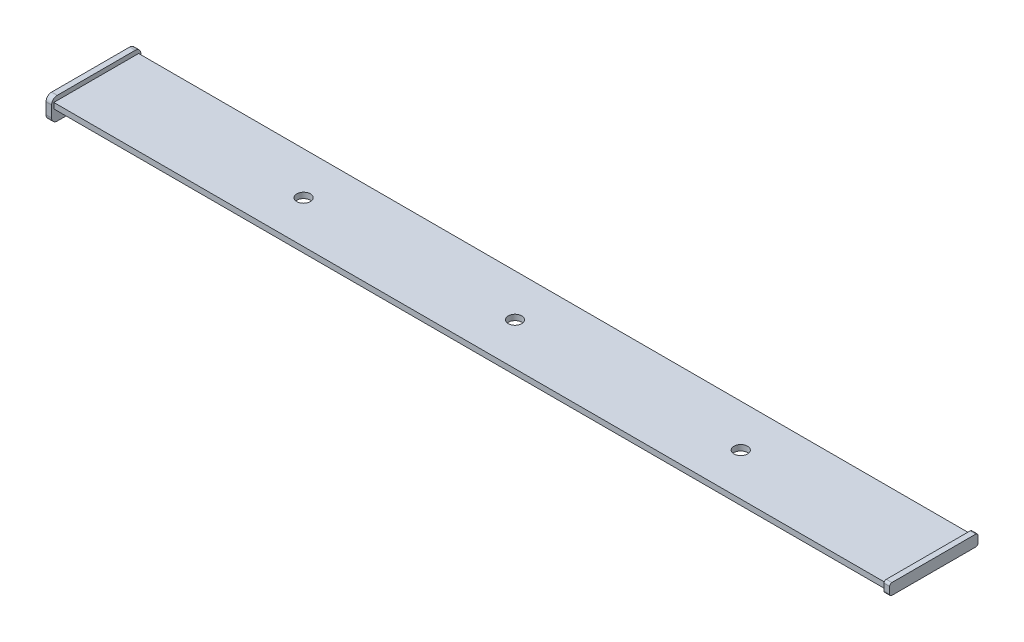
ISO-10303-21;
HEADER;
FILE_DESCRIPTION(('STEP AP214'),'2;1');
FILE_NAME('part.step','',(''),(''),'','','');
FILE_SCHEMA(('AUTOMOTIVE_DESIGN { 1 0 10303 214 1 1 1 1 }'));
ENDSEC;
DATA;
#1=APPLICATION_CONTEXT('core data for automotive mechanical design processes');
#2=APPLICATION_PROTOCOL_DEFINITION('international standard','automotive_design',2000,#1);
#3=PRODUCT_CONTEXT('',#1,'mechanical');
#4=PRODUCT('Part','Part','',(#3));
#5=PRODUCT_RELATED_PRODUCT_CATEGORY('part','',(#4));
#6=PRODUCT_DEFINITION_FORMATION('','',#4);
#7=PRODUCT_DEFINITION_CONTEXT('part definition',#1,'design');
#8=PRODUCT_DEFINITION('design','',#6,#7);
#9=PRODUCT_DEFINITION_SHAPE('','',#8);
#10=(LENGTH_UNIT() NAMED_UNIT(*) SI_UNIT(.MILLI.,.METRE.));
#11=(NAMED_UNIT(*) PLANE_ANGLE_UNIT() SI_UNIT($,.RADIAN.));
#12=(NAMED_UNIT(*) SI_UNIT($,.STERADIAN.) SOLID_ANGLE_UNIT());
#13=UNCERTAINTY_MEASURE_WITH_UNIT(LENGTH_MEASURE(1.E-05),#10,'distance_accuracy_value','');
#14=(GEOMETRIC_REPRESENTATION_CONTEXT(3) GLOBAL_UNCERTAINTY_ASSIGNED_CONTEXT((#13)) GLOBAL_UNIT_ASSIGNED_CONTEXT((#10,
#11,#12)) REPRESENTATION_CONTEXT('',''));
#15=CARTESIAN_POINT('',(0.,0.,0.));
#16=DIRECTION('',(0.,0.,1.));
#17=DIRECTION('',(1.,0.,0.));
#18=AXIS2_PLACEMENT_3D('',#15,#16,#17);
#19=CARTESIAN_POINT('',(0.,0.,0.));
#20=DIRECTION('',(0.,-1.,0.));
#21=DIRECTION('',(0.,0.,-1.));
#22=AXIS2_PLACEMENT_3D('',#19,#20,#21);
#23=PLANE('',#22);
#24=DIRECTION('',(-1.,0.,0.));
#25=VECTOR('',#24,1.);
#26=CARTESIAN_POINT('',(0.,0.,157.611800850735));
#27=LINE('',#26,#25);
#28=CARTESIAN_POINT('',(1850.,0.,157.611800850736));
#29=VERTEX_POINT('',#28);
#30=CARTESIAN_POINT('',(-1875.,0.,157.611800850735));
#31=VERTEX_POINT('',#30);
#32=EDGE_CURVE('E52',#29,#31,#27,.T.);
#33=ORIENTED_EDGE('',*,*,#32,.F.);
#34=DIRECTION('',(0.,0.,1.));
#35=VECTOR('',#34,1.);
#36=CARTESIAN_POINT('',(1850.,0.,0.));
#37=LINE('',#36,#35);
#38=CARTESIAN_POINT('',(1850.,0.,189.84375));
#39=VERTEX_POINT('',#38);
#40=EDGE_CURVE('E67',#29,#39,#37,.T.);
#41=ORIENTED_EDGE('',*,*,#40,.T.);
#42=DIRECTION('',(1.,0.,0.));
#43=VECTOR('',#42,1.);
#44=CARTESIAN_POINT('',(-1875.,0.,189.84375));
#45=LINE('',#44,#43);
#46=CARTESIAN_POINT('',(-1875.,0.,189.84375));
#47=VERTEX_POINT('',#46);
#48=EDGE_CURVE('E469',#47,#39,#45,.T.);
#49=ORIENTED_EDGE('',*,*,#48,.F.);
#50=DIRECTION('',(0.,0.,1.));
#51=VECTOR('',#50,1.);
#52=CARTESIAN_POINT('',(-1875.,0.,189.84375));
#53=LINE('',#52,#51);
#54=EDGE_CURVE('E480',#31,#47,#53,.T.);
#55=ORIENTED_EDGE('',*,*,#54,.F.);
#56=EDGE_LOOP('',(#33,#41,#49,#55));
#57=FACE_BOUND('',#56,.T.);
#58=ADVANCED_FACE('F43',(#57),#23,.T.);
#59=DIRECTION('',(-1.,0.,0.));
#60=VECTOR('',#59,1.);
#61=CARTESIAN_POINT('',(-1875.,0.,-189.84375));
#62=LINE('',#61,#60);
#63=CARTESIAN_POINT('',(1850.,0.,-189.84375));
#64=VERTEX_POINT('',#63);
#65=CARTESIAN_POINT('',(-1875.,0.,-189.84375));
#66=VERTEX_POINT('',#65);
#67=EDGE_CURVE('E439',#64,#66,#62,.T.);
#68=ORIENTED_EDGE('',*,*,#67,.F.);
#69=DIRECTION('',(0.,0.,1.));
#70=VECTOR('',#69,1.);
#71=CARTESIAN_POINT('',(1850.,0.,0.));
#72=LINE('',#71,#70);
#73=CARTESIAN_POINT('',(1850.,0.,-157.611800850736));
#74=VERTEX_POINT('',#73);
#75=EDGE_CURVE('E385',#64,#74,#72,.T.);
#76=ORIENTED_EDGE('',*,*,#75,.T.);
#77=DIRECTION('',(1.,0.,0.));
#78=VECTOR('',#77,1.);
#79=CARTESIAN_POINT('',(1931.14623816858,0.,-157.611800850736));
#80=LINE('',#79,#78);
#81=CARTESIAN_POINT('',(-1875.,0.,-157.611800850735));
#82=VERTEX_POINT('',#81);
#83=EDGE_CURVE('E435',#82,#74,#80,.T.);
#84=ORIENTED_EDGE('',*,*,#83,.F.);
#85=EDGE_CURVE('E481',#66,#82,#53,.T.);
#86=ORIENTED_EDGE('',*,*,#85,.F.);
#87=EDGE_LOOP('',(#68,#76,#84,#86));
#88=FACE_BOUND('',#87,.T.);
#89=ADVANCED_FACE('F533',(#88),#23,.T.);
#90=CARTESIAN_POINT('',(-1875.,25.,-189.84375));
#91=DIRECTION('',(0.,0.,1.));
#92=DIRECTION('',(1.,0.,0.));
#93=AXIS2_PLACEMENT_3D('',#90,#91,#92);
#94=PLANE('',#93);
#95=DIRECTION('',(0.,1.,0.));
#96=VECTOR('',#95,1.);
#97=CARTESIAN_POINT('',(1850.,25.,-189.84375));
#98=LINE('',#97,#96);
#99=CARTESIAN_POINT('',(1850.,25.,-189.84375));
#100=VERTEX_POINT('',#99);
#101=EDGE_CURVE('E59',#64,#100,#98,.T.);
#102=ORIENTED_EDGE('',*,*,#101,.F.);
#103=ORIENTED_EDGE('',*,*,#67,.T.);
#104=DIRECTION('',(0.,-1.,0.));
#105=VECTOR('',#104,1.);
#106=CARTESIAN_POINT('',(-1875.,25.,-189.84375));
#107=LINE('',#106,#105);
#108=CARTESIAN_POINT('',(-1875.,25.,-189.84375));
#109=VERTEX_POINT('',#108);
#110=EDGE_CURVE('E490',#109,#66,#107,.T.);
#111=ORIENTED_EDGE('',*,*,#110,.F.);
#112=DIRECTION('',(-1.,0.,0.));
#113=VECTOR('',#112,1.);
#114=CARTESIAN_POINT('',(-1875.,25.,-189.84375));
#115=LINE('',#114,#113);
#116=EDGE_CURVE('E464',#100,#109,#115,.T.);
#117=ORIENTED_EDGE('',*,*,#116,.F.);
#118=EDGE_LOOP('',(#102,#103,#111,#117));
#119=FACE_BOUND('',#118,.T.);
#120=ADVANCED_FACE('F530',(#119),#94,.F.);
#121=CARTESIAN_POINT('',(-1875.,25.,189.84375));
#122=DIRECTION('',(0.,0.,-1.));
#123=DIRECTION('',(-1.,0.,0.));
#124=AXIS2_PLACEMENT_3D('',#121,#122,#123);
#125=PLANE('',#124);
#126=DIRECTION('',(0.,-1.,0.));
#127=VECTOR('',#126,1.);
#128=CARTESIAN_POINT('',(1850.,25.,189.84375));
#129=LINE('',#128,#127);
#130=CARTESIAN_POINT('',(1850.,25.,189.84375));
#131=VERTEX_POINT('',#130);
#132=EDGE_CURVE('E381',#131,#39,#129,.T.);
#133=ORIENTED_EDGE('',*,*,#132,.F.);
#134=DIRECTION('',(1.,0.,0.));
#135=VECTOR('',#134,1.);
#136=CARTESIAN_POINT('',(-1875.,25.,189.84375));
#137=LINE('',#136,#135);
#138=CARTESIAN_POINT('',(-1875.,25.,189.84375));
#139=VERTEX_POINT('',#138);
#140=EDGE_CURVE('E473',#139,#131,#137,.T.);
#141=ORIENTED_EDGE('',*,*,#140,.F.);
#142=DIRECTION('',(0.,-1.,0.));
#143=VECTOR('',#142,1.);
#144=CARTESIAN_POINT('',(-1875.,25.,189.84375));
#145=LINE('',#144,#143);
#146=EDGE_CURVE('E477',#139,#47,#145,.T.);
#147=ORIENTED_EDGE('',*,*,#146,.T.);
#148=ORIENTED_EDGE('',*,*,#48,.T.);
#149=EDGE_LOOP('',(#133,#141,#147,#148));
#150=FACE_BOUND('',#149,.T.);
#151=ADVANCED_FACE('F525',(#150),#125,.F.);
#152=CARTESIAN_POINT('',(0.,25.,0.));
#153=DIRECTION('',(0.,-1.,0.));
#154=DIRECTION('',(0.,0.,-1.));
#155=AXIS2_PLACEMENT_3D('',#152,#153,#154);
#156=PLANE('',#155);
#157=CARTESIAN_POINT('',(0.,25.,0.));
#158=DIRECTION('',(0.,-1.,0.));
#159=DIRECTION('',(0.,0.,-1.));
#160=AXIS2_PLACEMENT_3D('',#157,#158,#159);
#161=CIRCLE('',#160,30.3811390822481);
#162=CARTESIAN_POINT('',(0.,25.,-30.3811390822481));
#163=VERTEX_POINT('',#162);
#164=EDGE_CURVE('E411',#163,#163,#161,.T.);
#165=ORIENTED_EDGE('',*,*,#164,.T.);
#166=EDGE_LOOP('',(#165));
#167=FACE_BOUND('',#166,.T.);
#168=CARTESIAN_POINT('',(-946.305515807381,25.,0.));
#169=DIRECTION('',(0.,-1.,0.));
#170=DIRECTION('',(0.,0.,-1.));
#171=AXIS2_PLACEMENT_3D('',#168,#169,#170);
#172=CIRCLE('',#171,30.3811390822481);
#173=CARTESIAN_POINT('',(-946.305515807381,25.,-30.3811390822481));
#174=VERTEX_POINT('',#173);
#175=EDGE_CURVE('E400',#174,#174,#172,.T.);
#176=ORIENTED_EDGE('',*,*,#175,.T.);
#177=EDGE_LOOP('',(#176));
#178=FACE_BOUND('',#177,.T.);
#179=CARTESIAN_POINT('',(1010.60365189735,25.,0.));
#180=DIRECTION('',(0.,-1.,0.));
#181=DIRECTION('',(0.,0.,-1.));
#182=AXIS2_PLACEMENT_3D('',#179,#180,#181);
#183=CIRCLE('',#182,30.3811390822481);
#184=CARTESIAN_POINT('',(1010.60365189735,25.,-30.3811390822481));
#185=VERTEX_POINT('',#184);
#186=EDGE_CURVE('E394',#185,#185,#183,.T.);
#187=ORIENTED_EDGE('',*,*,#186,.T.);
#188=EDGE_LOOP('',(#187));
#189=FACE_BOUND('',#188,.T.);
#190=DIRECTION('',(0.,0.,1.));
#191=VECTOR('',#190,1.);
#192=CARTESIAN_POINT('',(1850.,25.,0.));
#193=LINE('',#192,#191);
#194=EDGE_CURVE('E388',#100,#131,#193,.T.);
#195=ORIENTED_EDGE('',*,*,#194,.F.);
#196=ORIENTED_EDGE('',*,*,#116,.T.);
#197=DIRECTION('',(0.,0.,1.));
#198=VECTOR('',#197,1.);
#199=CARTESIAN_POINT('',(-1875.,25.,189.84375));
#200=LINE('',#199,#198);
#201=EDGE_CURVE('E468',#109,#139,#200,.T.);
#202=ORIENTED_EDGE('',*,*,#201,.T.);
#203=ORIENTED_EDGE('',*,*,#140,.T.);
#204=EDGE_LOOP('',(#195,#196,#202,#203));
#205=FACE_BOUND('',#204,.T.);
#206=ADVANCED_FACE('F527',(#167,#178,#189,#205),#156,.F.);
#207=CARTESIAN_POINT('',(1010.60365189735,0.,0.));
#208=DIRECTION('',(0.,-1.,0.));
#209=DIRECTION('',(0.,0.,-1.));
#210=AXIS2_PLACEMENT_3D('',#207,#208,#209);
#211=CIRCLE('',#210,30.3811390822481);
#212=CARTESIAN_POINT('',(1010.60365189735,0.,-30.3811390822481));
#213=VERTEX_POINT('',#212);
#214=EDGE_CURVE('E404',#213,#213,#211,.T.);
#215=ORIENTED_EDGE('',*,*,#214,.F.);
#216=EDGE_LOOP('',(#215));
#217=FACE_BOUND('',#216,.T.);
#218=CARTESIAN_POINT('',(-946.305515807381,0.,0.));
#219=DIRECTION('',(0.,-1.,0.));
#220=DIRECTION('',(0.,0.,-1.));
#221=AXIS2_PLACEMENT_3D('',#218,#219,#220);
#222=CIRCLE('',#221,30.3811390822481);
#223=CARTESIAN_POINT('',(-946.305515807381,0.,-30.3811390822481));
#224=VERTEX_POINT('',#223);
#225=EDGE_CURVE('E395',#224,#224,#222,.T.);
#226=ORIENTED_EDGE('',*,*,#225,.F.);
#227=EDGE_LOOP('',(#226));
#228=FACE_BOUND('',#227,.T.);
#229=CARTESIAN_POINT('',(0.,0.,0.));
#230=DIRECTION('',(0.,-1.,0.));
#231=DIRECTION('',(0.,0.,-1.));
#232=AXIS2_PLACEMENT_3D('',#229,#230,#231);
#233=CIRCLE('',#232,30.3811390822481);
#234=CARTESIAN_POINT('',(0.,0.,-30.3811390822481));
#235=VERTEX_POINT('',#234);
#236=EDGE_CURVE('E399',#235,#235,#233,.T.);
#237=ORIENTED_EDGE('',*,*,#236,.F.);
#238=EDGE_LOOP('',(#237));
#239=FACE_BOUND('',#238,.T.);
#240=DIRECTION('',(-1.,0.,0.));
#241=VECTOR('',#240,1.);
#242=CARTESIAN_POINT('',(0.,0.,-142.611800850735));
#243=LINE('',#242,#241);
#244=CARTESIAN_POINT('',(1850.,0.,-142.611800850736));
#245=VERTEX_POINT('',#244);
#246=CARTESIAN_POINT('',(-1875.,0.,-142.611800850735));
#247=VERTEX_POINT('',#246);
#248=EDGE_CURVE('E493',#245,#247,#243,.T.);
#249=ORIENTED_EDGE('',*,*,#248,.F.);
#250=DIRECTION('',(0.,0.,1.));
#251=VECTOR('',#250,1.);
#252=CARTESIAN_POINT('',(1850.,0.,0.));
#253=LINE('',#252,#251);
#254=CARTESIAN_POINT('',(1850.,0.,142.611800850736));
#255=VERTEX_POINT('',#254);
#256=EDGE_CURVE('E359',#245,#255,#253,.T.);
#257=ORIENTED_EDGE('',*,*,#256,.T.);
#258=DIRECTION('',(1.,0.,0.));
#259=VECTOR('',#258,1.);
#260=CARTESIAN_POINT('',(1931.14623816858,0.,142.611800850736));
#261=LINE('',#260,#259);
#262=CARTESIAN_POINT('',(-1875.,0.,142.611800850735));
#263=VERTEX_POINT('',#262);
#264=EDGE_CURVE('E424',#263,#255,#261,.T.);
#265=ORIENTED_EDGE('',*,*,#264,.F.);
#266=EDGE_CURVE('E484',#247,#263,#53,.T.);
#267=ORIENTED_EDGE('',*,*,#266,.F.);
#268=EDGE_LOOP('',(#249,#257,#265,#267));
#269=FACE_BOUND('',#268,.T.);
#270=ADVANCED_FACE('F516',(#217,#228,#239,#269),#23,.T.);
#271=CARTESIAN_POINT('',(0.,15.,0.));
#272=DIRECTION('',(0.,1.,0.));
#273=DIRECTION('',(0.,0.,1.));
#274=AXIS2_PLACEMENT_3D('',#271,#272,#273);
#275=PLANE('',#274);
#276=DIRECTION('',(0.,0.,-1.));
#277=VECTOR('',#276,1.);
#278=CARTESIAN_POINT('',(1850.,15.,0.));
#279=LINE('',#278,#277);
#280=CARTESIAN_POINT('',(1850.,15.,-142.611800850736));
#281=VERTEX_POINT('',#280);
#282=CARTESIAN_POINT('',(1850.,15.,-157.611800850736));
#283=VERTEX_POINT('',#282);
#284=EDGE_CURVE('E371',#281,#283,#279,.T.);
#285=ORIENTED_EDGE('',*,*,#284,.F.);
#286=DIRECTION('',(-1.,0.,0.));
#287=VECTOR('',#286,1.);
#288=CARTESIAN_POINT('',(1931.14623816858,15.,-142.611800850736));
#289=LINE('',#288,#287);
#290=CARTESIAN_POINT('',(-1875.,15.,-142.611800850735));
#291=VERTEX_POINT('',#290);
#292=EDGE_CURVE('E457',#281,#291,#289,.T.);
#293=ORIENTED_EDGE('',*,*,#292,.T.);
#294=DIRECTION('',(0.,0.,-1.));
#295=VECTOR('',#294,1.);
#296=CARTESIAN_POINT('',(-1875.,15.,-157.611800850735));
#297=LINE('',#296,#295);
#298=CARTESIAN_POINT('',(-1875.,15.,-157.611800850735));
#299=VERTEX_POINT('',#298);
#300=EDGE_CURVE('E446',#291,#299,#297,.T.);
#301=ORIENTED_EDGE('',*,*,#300,.T.);
#302=DIRECTION('',(1.,0.,0.));
#303=VECTOR('',#302,1.);
#304=CARTESIAN_POINT('',(1931.14623816858,15.,-157.611800850736));
#305=LINE('',#304,#303);
#306=EDGE_CURVE('E453',#299,#283,#305,.T.);
#307=ORIENTED_EDGE('',*,*,#306,.T.);
#308=EDGE_LOOP('',(#285,#293,#301,#307));
#309=FACE_BOUND('',#308,.T.);
#310=ADVANCED_FACE('F539',(#309),#275,.F.);
#311=CARTESIAN_POINT('',(1931.14623816858,15.,-157.611800850736));
#312=DIRECTION('',(0.,0.,-1.));
#313=DIRECTION('',(-1.,0.,0.));
#314=AXIS2_PLACEMENT_3D('',#311,#312,#313);
#315=PLANE('',#314);
#316=DIRECTION('',(0.,-1.,0.));
#317=VECTOR('',#316,1.);
#318=CARTESIAN_POINT('',(1850.,15.,-157.611800850736));
#319=LINE('',#318,#317);
#320=EDGE_CURVE('E377',#283,#74,#319,.T.);
#321=ORIENTED_EDGE('',*,*,#320,.F.);
#322=ORIENTED_EDGE('',*,*,#306,.F.);
#323=DIRECTION('',(0.,-1.,0.));
#324=VECTOR('',#323,1.);
#325=CARTESIAN_POINT('',(-1875.,15.,-157.611800850735));
#326=LINE('',#325,#324);
#327=EDGE_CURVE('E415',#299,#82,#326,.T.);
#328=ORIENTED_EDGE('',*,*,#327,.T.);
#329=ORIENTED_EDGE('',*,*,#83,.T.);
#330=EDGE_LOOP('',(#321,#322,#328,#329));
#331=FACE_BOUND('',#330,.T.);
#332=ADVANCED_FACE('F535',(#331),#315,.F.);
#333=CARTESIAN_POINT('',(1931.14623816858,15.,-142.611800850736));
#334=DIRECTION('',(0.,0.,1.));
#335=DIRECTION('',(1.,0.,0.));
#336=AXIS2_PLACEMENT_3D('',#333,#334,#335);
#337=PLANE('',#336);
#338=DIRECTION('',(0.,1.,0.));
#339=VECTOR('',#338,1.);
#340=CARTESIAN_POINT('',(1850.,15.,-142.611800850736));
#341=LINE('',#340,#339);
#342=EDGE_CURVE('E367',#245,#281,#341,.T.);
#343=ORIENTED_EDGE('',*,*,#342,.F.);
#344=ORIENTED_EDGE('',*,*,#248,.T.);
#345=DIRECTION('',(0.,-1.,0.));
#346=VECTOR('',#345,1.);
#347=CARTESIAN_POINT('',(-1875.,15.,-142.611800850735));
#348=LINE('',#347,#346);
#349=EDGE_CURVE('E443',#291,#247,#348,.T.);
#350=ORIENTED_EDGE('',*,*,#349,.F.);
#351=ORIENTED_EDGE('',*,*,#292,.F.);
#352=EDGE_LOOP('',(#343,#344,#350,#351));
#353=FACE_BOUND('',#352,.T.);
#354=ADVANCED_FACE('F541',(#353),#337,.F.);
#355=CARTESIAN_POINT('',(0.,15.,0.));
#356=DIRECTION('',(0.,1.,0.));
#357=DIRECTION('',(0.,0.,1.));
#358=AXIS2_PLACEMENT_3D('',#355,#356,#357);
#359=PLANE('',#358);
#360=DIRECTION('',(0.,0.,-1.));
#361=VECTOR('',#360,1.);
#362=CARTESIAN_POINT('',(1850.,15.,0.));
#363=LINE('',#362,#361);
#364=CARTESIAN_POINT('',(1850.,15.,157.611800850736));
#365=VERTEX_POINT('',#364);
#366=CARTESIAN_POINT('',(1850.,15.,142.611800850736));
#367=VERTEX_POINT('',#366);
#368=EDGE_CURVE('E335',#365,#367,#363,.T.);
#369=ORIENTED_EDGE('',*,*,#368,.F.);
#370=DIRECTION('',(-1.,0.,0.));
#371=VECTOR('',#370,1.);
#372=CARTESIAN_POINT('',(1931.14623816858,15.,157.611800850736));
#373=LINE('',#372,#371);
#374=CARTESIAN_POINT('',(-1875.,15.,157.611800850735));
#375=VERTEX_POINT('',#374);
#376=EDGE_CURVE('E428',#365,#375,#373,.T.);
#377=ORIENTED_EDGE('',*,*,#376,.T.);
#378=DIRECTION('',(0.,0.,-1.));
#379=VECTOR('',#378,1.);
#380=CARTESIAN_POINT('',(-1875.,15.,157.611800850735));
#381=LINE('',#380,#379);
#382=CARTESIAN_POINT('',(-1875.,15.,142.611800850735));
#383=VERTEX_POINT('',#382);
#384=EDGE_CURVE('E419',#375,#383,#381,.T.);
#385=ORIENTED_EDGE('',*,*,#384,.T.);
#386=DIRECTION('',(1.,0.,0.));
#387=VECTOR('',#386,1.);
#388=CARTESIAN_POINT('',(1931.14623816858,15.,142.611800850736));
#389=LINE('',#388,#387);
#390=EDGE_CURVE('E423',#383,#367,#389,.T.);
#391=ORIENTED_EDGE('',*,*,#390,.T.);
#392=EDGE_LOOP('',(#369,#377,#385,#391));
#393=FACE_BOUND('',#392,.T.);
#394=ADVANCED_FACE('F522',(#393),#359,.F.);
#395=CARTESIAN_POINT('',(1931.14623816858,15.,157.611800850736));
#396=DIRECTION('',(0.,0.,1.));
#397=DIRECTION('',(1.,0.,0.));
#398=AXIS2_PLACEMENT_3D('',#395,#396,#397);
#399=PLANE('',#398);
#400=DIRECTION('',(0.,1.,0.));
#401=VECTOR('',#400,1.);
#402=CARTESIAN_POINT('',(1850.,15.,157.611800850736));
#403=LINE('',#402,#401);
#404=EDGE_CURVE('E363',#29,#365,#403,.T.);
#405=ORIENTED_EDGE('',*,*,#404,.F.);
#406=ORIENTED_EDGE('',*,*,#32,.T.);
#407=DIRECTION('',(0.,-1.,0.));
#408=VECTOR('',#407,1.);
#409=CARTESIAN_POINT('',(-1875.,15.,157.611800850735));
#410=LINE('',#409,#408);
#411=EDGE_CURVE('E436',#375,#31,#410,.T.);
#412=ORIENTED_EDGE('',*,*,#411,.F.);
#413=ORIENTED_EDGE('',*,*,#376,.F.);
#414=EDGE_LOOP('',(#405,#406,#412,#413));
#415=FACE_BOUND('',#414,.T.);
#416=ADVANCED_FACE('F501',(#415),#399,.F.);
#417=CARTESIAN_POINT('',(1931.14623816858,15.,142.611800850736));
#418=DIRECTION('',(0.,0.,-1.));
#419=DIRECTION('',(-1.,0.,0.));
#420=AXIS2_PLACEMENT_3D('',#417,#418,#419);
#421=PLANE('',#420);
#422=DIRECTION('',(0.,-1.,0.));
#423=VECTOR('',#422,1.);
#424=CARTESIAN_POINT('',(1850.,15.,142.611800850736));
#425=LINE('',#424,#423);
#426=EDGE_CURVE('E11',#367,#255,#425,.T.);
#427=ORIENTED_EDGE('',*,*,#426,.F.);
#428=ORIENTED_EDGE('',*,*,#390,.F.);
#429=DIRECTION('',(0.,-1.,0.));
#430=VECTOR('',#429,1.);
#431=CARTESIAN_POINT('',(-1875.,15.,142.611800850735));
#432=LINE('',#431,#430);
#433=EDGE_CURVE('E432',#383,#263,#432,.T.);
#434=ORIENTED_EDGE('',*,*,#433,.T.);
#435=ORIENTED_EDGE('',*,*,#264,.T.);
#436=EDGE_LOOP('',(#427,#428,#434,#435));
#437=FACE_BOUND('',#436,.T.);
#438=ADVANCED_FACE('F515',(#437),#421,.F.);
#439=CARTESIAN_POINT('',(0.,25.,0.));
#440=DIRECTION('',(0.,-1.,0.));
#441=DIRECTION('',(0.,0.,-1.));
#442=AXIS2_PLACEMENT_3D('',#439,#440,#441);
#443=CYLINDRICAL_SURFACE('',#442,30.3811390822481);
#444=ORIENTED_EDGE('',*,*,#164,.F.);
#445=EDGE_LOOP('',(#444));
#446=FACE_BOUND('',#445,.T.);
#447=ORIENTED_EDGE('',*,*,#236,.T.);
#448=EDGE_LOOP('',(#447));
#449=FACE_BOUND('',#448,.T.);
#450=ADVANCED_FACE('F571',(#446,#449),#443,.F.);
#451=CARTESIAN_POINT('',(-946.305515807381,25.,0.));
#452=DIRECTION('',(0.,-1.,0.));
#453=DIRECTION('',(0.,0.,-1.));
#454=AXIS2_PLACEMENT_3D('',#451,#452,#453);
#455=CYLINDRICAL_SURFACE('',#454,30.3811390822481);
#456=ORIENTED_EDGE('',*,*,#175,.F.);
#457=EDGE_LOOP('',(#456));
#458=FACE_BOUND('',#457,.T.);
#459=ORIENTED_EDGE('',*,*,#225,.T.);
#460=EDGE_LOOP('',(#459));
#461=FACE_BOUND('',#460,.T.);
#462=ADVANCED_FACE('F573',(#458,#461),#455,.F.);
#463=CARTESIAN_POINT('',(1010.60365189735,25.,0.));
#464=DIRECTION('',(0.,-1.,0.));
#465=DIRECTION('',(0.,0.,-1.));
#466=AXIS2_PLACEMENT_3D('',#463,#464,#465);
#467=CYLINDRICAL_SURFACE('',#466,30.3811390822481);
#468=ORIENTED_EDGE('',*,*,#186,.F.);
#469=EDGE_LOOP('',(#468));
#470=FACE_BOUND('',#469,.T.);
#471=ORIENTED_EDGE('',*,*,#214,.T.);
#472=EDGE_LOOP('',(#471));
#473=FACE_BOUND('',#472,.T.);
#474=ADVANCED_FACE('F580',(#470,#473),#467,.F.);
#475=CARTESIAN_POINT('',(1850.,-2.5,-187.814440115148));
#476=DIRECTION('',(1.,0.,0.));
#477=DIRECTION('',(0.,0.,-1.));
#478=AXIS2_PLACEMENT_3D('',#475,#476,#477);
#479=PLANE('',#478);
#480=CARTESIAN_POINT('',(1850.,-2.5,-187.814440115148));
#481=DIRECTION('',(1.,0.,0.));
#482=DIRECTION('',(0.,0.,-1.));
#483=AXIS2_PLACEMENT_3D('',#480,#481,#482);
#484=CIRCLE('',#483,10.);
#485=CARTESIAN_POINT('',(1850.,-12.5,-187.814440115148));
#486=VERTEX_POINT('',#485);
#487=CARTESIAN_POINT('',(1850.,-2.5,-197.814440115148));
#488=VERTEX_POINT('',#487);
#489=EDGE_CURVE('E272',#486,#488,#484,.T.);
#490=ORIENTED_EDGE('',*,*,#489,.F.);
#491=DIRECTION('',(0.,0.,-1.));
#492=VECTOR('',#491,1.);
#493=CARTESIAN_POINT('',(1850.,-12.5,187.814440115148));
#494=LINE('',#493,#492);
#495=CARTESIAN_POINT('',(1850.,-12.5,187.814440115148));
#496=VERTEX_POINT('',#495);
#497=EDGE_CURVE('E301',#496,#486,#494,.T.);
#498=ORIENTED_EDGE('',*,*,#497,.F.);
#499=CARTESIAN_POINT('',(1850.,-2.5,187.814440115148));
#500=DIRECTION('',(1.,0.,0.));
#501=DIRECTION('',(0.,0.,1.));
#502=AXIS2_PLACEMENT_3D('',#499,#500,#501);
#503=CIRCLE('',#502,10.);
#504=CARTESIAN_POINT('',(1850.,-2.5,197.814440115148));
#505=VERTEX_POINT('',#504);
#506=EDGE_CURVE('E297',#505,#496,#503,.T.);
#507=ORIENTED_EDGE('',*,*,#506,.F.);
#508=DIRECTION('',(0.,-1.,0.));
#509=VECTOR('',#508,1.);
#510=CARTESIAN_POINT('',(1850.,-2.5,197.814440115148));
#511=LINE('',#510,#509);
#512=CARTESIAN_POINT('',(1850.,27.5,197.814440115148));
#513=VERTEX_POINT('',#512);
#514=EDGE_CURVE('E293',#513,#505,#511,.T.);
#515=ORIENTED_EDGE('',*,*,#514,.F.);
#516=CARTESIAN_POINT('',(1850.,27.5,187.814440115148));
#517=DIRECTION('',(1.,0.,0.));
#518=DIRECTION('',(0.,0.,1.));
#519=AXIS2_PLACEMENT_3D('',#516,#517,#518);
#520=CIRCLE('',#519,10.);
#521=CARTESIAN_POINT('',(1850.,37.5,187.814440115148));
#522=VERTEX_POINT('',#521);
#523=EDGE_CURVE('E289',#522,#513,#520,.T.);
#524=ORIENTED_EDGE('',*,*,#523,.F.);
#525=DIRECTION('',(0.,0.,1.));
#526=VECTOR('',#525,1.);
#527=CARTESIAN_POINT('',(1850.,37.5,187.814440115148));
#528=LINE('',#527,#526);
#529=CARTESIAN_POINT('',(1850.,37.5,-187.814440115148));
#530=VERTEX_POINT('',#529);
#531=EDGE_CURVE('E285',#530,#522,#528,.T.);
#532=ORIENTED_EDGE('',*,*,#531,.F.);
#533=CARTESIAN_POINT('',(1850.,27.5,-187.814440115148));
#534=DIRECTION('',(1.,0.,0.));
#535=DIRECTION('',(0.,0.,1.));
#536=AXIS2_PLACEMENT_3D('',#533,#534,#535);
#537=CIRCLE('',#536,10.);
#538=CARTESIAN_POINT('',(1850.,27.5,-197.814440115148));
#539=VERTEX_POINT('',#538);
#540=EDGE_CURVE('E281',#539,#530,#537,.T.);
#541=ORIENTED_EDGE('',*,*,#540,.F.);
#542=DIRECTION('',(0.,1.,0.));
#543=VECTOR('',#542,1.);
#544=CARTESIAN_POINT('',(1850.,-2.5,-197.814440115148));
#545=LINE('',#544,#543);
#546=EDGE_CURVE('E276',#488,#539,#545,.T.);
#547=ORIENTED_EDGE('',*,*,#546,.F.);
#548=EDGE_LOOP('',(#490,#498,#507,#515,#524,#532,#541,#547));
#549=FACE_BOUND('',#548,.T.);
#550=ORIENTED_EDGE('',*,*,#75,.F.);
#551=ORIENTED_EDGE('',*,*,#101,.T.);
#552=ORIENTED_EDGE('',*,*,#194,.T.);
#553=ORIENTED_EDGE('',*,*,#132,.T.);
#554=ORIENTED_EDGE('',*,*,#40,.F.);
#555=ORIENTED_EDGE('',*,*,#404,.T.);
#556=ORIENTED_EDGE('',*,*,#368,.T.);
#557=ORIENTED_EDGE('',*,*,#426,.T.);
#558=ORIENTED_EDGE('',*,*,#256,.F.);
#559=ORIENTED_EDGE('',*,*,#342,.T.);
#560=ORIENTED_EDGE('',*,*,#284,.T.);
#561=ORIENTED_EDGE('',*,*,#320,.T.);
#562=EDGE_LOOP('',(#550,#551,#552,#553,#554,#555,#556,#557,#558,#559,#560,#561));
#563=FACE_BOUND('',#562,.T.);
#564=ADVANCED_FACE('F520',(#549,#563),#479,.F.);
#565=CARTESIAN_POINT('',(1850.,-2.5,-187.814440115148));
#566=DIRECTION('',(1.,0.,0.));
#567=DIRECTION('',(0.,0.,-1.));
#568=AXIS2_PLACEMENT_3D('',#565,#566,#567);
#569=CYLINDRICAL_SURFACE('',#568,10.);
#570=CARTESIAN_POINT('',(1875.,-2.5,-187.814440115148));
#571=DIRECTION('',(1.,0.,0.));
#572=DIRECTION('',(0.,0.,-1.));
#573=AXIS2_PLACEMENT_3D('',#570,#571,#572);
#574=CIRCLE('',#573,10.);
#575=CARTESIAN_POINT('',(1875.,-12.5,-187.814440115148));
#576=VERTEX_POINT('',#575);
#577=CARTESIAN_POINT('',(1875.,-2.5,-197.814440115148));
#578=VERTEX_POINT('',#577);
#579=EDGE_CURVE('E261',#576,#578,#574,.T.);
#580=ORIENTED_EDGE('',*,*,#579,.F.);
#581=DIRECTION('',(1.,0.,0.));
#582=VECTOR('',#581,1.);
#583=CARTESIAN_POINT('',(1850.,-12.5,-187.814440115148));
#584=LINE('',#583,#582);
#585=EDGE_CURVE('E332',#486,#576,#584,.T.);
#586=ORIENTED_EDGE('',*,*,#585,.F.);
#587=ORIENTED_EDGE('',*,*,#489,.T.);
#588=DIRECTION('',(1.,0.,0.));
#589=VECTOR('',#588,1.);
#590=CARTESIAN_POINT('',(1850.,-2.5,-197.814440115148));
#591=LINE('',#590,#589);
#592=EDGE_CURVE('E304',#488,#578,#591,.T.);
#593=ORIENTED_EDGE('',*,*,#592,.T.);
#594=EDGE_LOOP('',(#580,#586,#587,#593));
#595=FACE_BOUND('',#594,.T.);
#596=ADVANCED_FACE('F781',(#595),#569,.T.);
#597=CARTESIAN_POINT('',(1850.,-12.5,187.814440115148));
#598=DIRECTION('',(0.,-1.,0.));
#599=DIRECTION('',(0.,0.,-1.));
#600=AXIS2_PLACEMENT_3D('',#597,#598,#599);
#601=PLANE('',#600);
#602=DIRECTION('',(0.,0.,-1.));
#603=VECTOR('',#602,1.);
#604=CARTESIAN_POINT('',(1875.,-12.5,187.814440115148));
#605=LINE('',#604,#603);
#606=CARTESIAN_POINT('',(1875.,-12.5,187.814440115148));
#607=VERTEX_POINT('',#606);
#608=EDGE_CURVE('E277',#607,#576,#605,.T.);
#609=ORIENTED_EDGE('',*,*,#608,.F.);
#610=DIRECTION('',(1.,0.,0.));
#611=VECTOR('',#610,1.);
#612=CARTESIAN_POINT('',(1850.,-12.5,187.814440115148));
#613=LINE('',#612,#611);
#614=EDGE_CURVE('E336',#496,#607,#613,.T.);
#615=ORIENTED_EDGE('',*,*,#614,.F.);
#616=ORIENTED_EDGE('',*,*,#497,.T.);
#617=ORIENTED_EDGE('',*,*,#585,.T.);
#618=EDGE_LOOP('',(#609,#615,#616,#617));
#619=FACE_BOUND('',#618,.T.);
#620=ADVANCED_FACE('F771',(#619),#601,.T.);
#621=CARTESIAN_POINT('',(1850.,-2.5,187.814440115148));
#622=DIRECTION('',(1.,0.,0.));
#623=DIRECTION('',(0.,0.,-1.));
#624=AXIS2_PLACEMENT_3D('',#621,#622,#623);
#625=CYLINDRICAL_SURFACE('',#624,10.);
#626=CARTESIAN_POINT('',(1875.,-2.5,187.814440115148));
#627=DIRECTION('',(1.,0.,0.));
#628=DIRECTION('',(0.,0.,1.));
#629=AXIS2_PLACEMENT_3D('',#626,#627,#628);
#630=CIRCLE('',#629,10.);
#631=CARTESIAN_POINT('',(1875.,-2.5,197.814440115148));
#632=VERTEX_POINT('',#631);
#633=EDGE_CURVE('E325',#632,#607,#630,.T.);
#634=ORIENTED_EDGE('',*,*,#633,.F.);
#635=DIRECTION('',(1.,0.,0.));
#636=VECTOR('',#635,1.);
#637=CARTESIAN_POINT('',(1850.,-2.5,197.814440115148));
#638=LINE('',#637,#636);
#639=EDGE_CURVE('E339',#505,#632,#638,.T.);
#640=ORIENTED_EDGE('',*,*,#639,.F.);
#641=ORIENTED_EDGE('',*,*,#506,.T.);
#642=ORIENTED_EDGE('',*,*,#614,.T.);
#643=EDGE_LOOP('',(#634,#640,#641,#642));
#644=FACE_BOUND('',#643,.T.);
#645=ADVANCED_FACE('F761',(#644),#625,.T.);
#646=CARTESIAN_POINT('',(1850.,-2.5,197.814440115148));
#647=DIRECTION('',(0.,0.,1.));
#648=DIRECTION('',(1.,0.,0.));
#649=AXIS2_PLACEMENT_3D('',#646,#647,#648);
#650=PLANE('',#649);
#651=DIRECTION('',(0.,-1.,0.));
#652=VECTOR('',#651,1.);
#653=CARTESIAN_POINT('',(1875.,-2.5,197.814440115148));
#654=LINE('',#653,#652);
#655=CARTESIAN_POINT('',(1875.,27.5,197.814440115148));
#656=VERTEX_POINT('',#655);
#657=EDGE_CURVE('E321',#656,#632,#654,.T.);
#658=ORIENTED_EDGE('',*,*,#657,.F.);
#659=DIRECTION('',(1.,0.,0.));
#660=VECTOR('',#659,1.);
#661=CARTESIAN_POINT('',(1850.,27.5,197.814440115148));
#662=LINE('',#661,#660);
#663=EDGE_CURVE('E342',#513,#656,#662,.T.);
#664=ORIENTED_EDGE('',*,*,#663,.F.);
#665=ORIENTED_EDGE('',*,*,#514,.T.);
#666=ORIENTED_EDGE('',*,*,#639,.T.);
#667=EDGE_LOOP('',(#658,#664,#665,#666));
#668=FACE_BOUND('',#667,.T.);
#669=ADVANCED_FACE('F751',(#668),#650,.T.);
#670=CARTESIAN_POINT('',(1850.,27.5,187.814440115148));
#671=DIRECTION('',(1.,0.,0.));
#672=DIRECTION('',(0.,0.,-1.));
#673=AXIS2_PLACEMENT_3D('',#670,#671,#672);
#674=CYLINDRICAL_SURFACE('',#673,10.);
#675=CARTESIAN_POINT('',(1875.,27.5,187.814440115148));
#676=DIRECTION('',(1.,0.,0.));
#677=DIRECTION('',(0.,0.,1.));
#678=AXIS2_PLACEMENT_3D('',#675,#676,#677);
#679=CIRCLE('',#678,10.);
#680=CARTESIAN_POINT('',(1875.,37.5,187.814440115148));
#681=VERTEX_POINT('',#680);
#682=EDGE_CURVE('E317',#681,#656,#679,.T.);
#683=ORIENTED_EDGE('',*,*,#682,.F.);
#684=DIRECTION('',(1.,0.,0.));
#685=VECTOR('',#684,1.);
#686=CARTESIAN_POINT('',(1850.,37.5,187.814440115148));
#687=LINE('',#686,#685);
#688=EDGE_CURVE('E345',#522,#681,#687,.T.);
#689=ORIENTED_EDGE('',*,*,#688,.F.);
#690=ORIENTED_EDGE('',*,*,#523,.T.);
#691=ORIENTED_EDGE('',*,*,#663,.T.);
#692=EDGE_LOOP('',(#683,#689,#690,#691));
#693=FACE_BOUND('',#692,.T.);
#694=ADVANCED_FACE('F741',(#693),#674,.T.);
#695=CARTESIAN_POINT('',(1850.,37.5,187.814440115148));
#696=DIRECTION('',(0.,1.,0.));
#697=DIRECTION('',(0.,0.,1.));
#698=AXIS2_PLACEMENT_3D('',#695,#696,#697);
#699=PLANE('',#698);
#700=DIRECTION('',(0.,0.,1.));
#701=VECTOR('',#700,1.);
#702=CARTESIAN_POINT('',(1875.,37.5,187.814440115148));
#703=LINE('',#702,#701);
#704=CARTESIAN_POINT('',(1875.,37.5,-187.814440115148));
#705=VERTEX_POINT('',#704);
#706=EDGE_CURVE('E313',#705,#681,#703,.T.);
#707=ORIENTED_EDGE('',*,*,#706,.F.);
#708=DIRECTION('',(1.,0.,0.));
#709=VECTOR('',#708,1.);
#710=CARTESIAN_POINT('',(1850.,37.5,-187.814440115148));
#711=LINE('',#710,#709);
#712=EDGE_CURVE('E348',#530,#705,#711,.T.);
#713=ORIENTED_EDGE('',*,*,#712,.F.);
#714=ORIENTED_EDGE('',*,*,#531,.T.);
#715=ORIENTED_EDGE('',*,*,#688,.T.);
#716=EDGE_LOOP('',(#707,#713,#714,#715));
#717=FACE_BOUND('',#716,.T.);
#718=ADVANCED_FACE('F731',(#717),#699,.T.);
#719=CARTESIAN_POINT('',(1850.,27.5,-187.814440115148));
#720=DIRECTION('',(1.,0.,0.));
#721=DIRECTION('',(0.,0.,-1.));
#722=AXIS2_PLACEMENT_3D('',#719,#720,#721);
#723=CYLINDRICAL_SURFACE('',#722,10.);
#724=CARTESIAN_POINT('',(1875.,27.5,-187.814440115148));
#725=DIRECTION('',(1.,0.,0.));
#726=DIRECTION('',(0.,0.,1.));
#727=AXIS2_PLACEMENT_3D('',#724,#725,#726);
#728=CIRCLE('',#727,10.);
#729=CARTESIAN_POINT('',(1875.,27.5,-197.814440115148));
#730=VERTEX_POINT('',#729);
#731=EDGE_CURVE('E309',#730,#705,#728,.T.);
#732=ORIENTED_EDGE('',*,*,#731,.F.);
#733=DIRECTION('',(1.,0.,0.));
#734=VECTOR('',#733,1.);
#735=CARTESIAN_POINT('',(1850.,27.5,-197.814440115148));
#736=LINE('',#735,#734);
#737=EDGE_CURVE('E351',#539,#730,#736,.T.);
#738=ORIENTED_EDGE('',*,*,#737,.F.);
#739=ORIENTED_EDGE('',*,*,#540,.T.);
#740=ORIENTED_EDGE('',*,*,#712,.T.);
#741=EDGE_LOOP('',(#732,#738,#739,#740));
#742=FACE_BOUND('',#741,.T.);
#743=ADVANCED_FACE('F721',(#742),#723,.T.);
#744=CARTESIAN_POINT('',(1850.,-2.5,-197.814440115148));
#745=DIRECTION('',(0.,0.,-1.));
#746=DIRECTION('',(0.,1.,0.));
#747=AXIS2_PLACEMENT_3D('',#744,#745,#746);
#748=PLANE('',#747);
#749=DIRECTION('',(0.,1.,0.));
#750=VECTOR('',#749,1.);
#751=CARTESIAN_POINT('',(1875.,-2.5,-197.814440115148));
#752=LINE('',#751,#750);
#753=EDGE_CURVE('E266',#578,#730,#752,.T.);
#754=ORIENTED_EDGE('',*,*,#753,.F.);
#755=ORIENTED_EDGE('',*,*,#592,.F.);
#756=ORIENTED_EDGE('',*,*,#546,.T.);
#757=ORIENTED_EDGE('',*,*,#737,.T.);
#758=EDGE_LOOP('',(#754,#755,#756,#757));
#759=FACE_BOUND('',#758,.T.);
#760=ADVANCED_FACE('F716',(#759),#748,.T.);
#761=CARTESIAN_POINT('',(1875.,25.,189.84375));
#762=DIRECTION('',(-1.,0.,0.));
#763=DIRECTION('',(0.,0.,1.));
#764=AXIS2_PLACEMENT_3D('',#761,#762,#763);
#765=PLANE('',#764);
#766=ORIENTED_EDGE('',*,*,#579,.T.);
#767=ORIENTED_EDGE('',*,*,#753,.T.);
#768=ORIENTED_EDGE('',*,*,#731,.T.);
#769=ORIENTED_EDGE('',*,*,#706,.T.);
#770=ORIENTED_EDGE('',*,*,#682,.T.);
#771=ORIENTED_EDGE('',*,*,#657,.T.);
#772=ORIENTED_EDGE('',*,*,#633,.T.);
#773=ORIENTED_EDGE('',*,*,#608,.T.);
#774=EDGE_LOOP('',(#766,#767,#768,#769,#770,#771,#772,#773));
#775=FACE_BOUND('',#774,.T.);
#776=ADVANCED_FACE('F45',(#775),#765,.F.);
#777=CARTESIAN_POINT('',(-1900.,-30.,-174.84375));
#778=DIRECTION('',(1.,0.,0.));
#779=DIRECTION('',(0.,0.,-1.));
#780=AXIS2_PLACEMENT_3D('',#777,#778,#779);
#781=CYLINDRICAL_SURFACE('',#780,25.);
#782=CARTESIAN_POINT('',(-1875.,-30.,-174.84375));
#783=DIRECTION('',(-1.,0.,0.));
#784=DIRECTION('',(0.,0.,1.));
#785=AXIS2_PLACEMENT_3D('',#782,#783,#784);
#786=CIRCLE('',#785,25.);
#787=CARTESIAN_POINT('',(-1875.,-29.9999999999998,-199.84375));
#788=VERTEX_POINT('',#787);
#789=CARTESIAN_POINT('',(-1875.,-55.,-174.84375));
#790=VERTEX_POINT('',#789);
#791=EDGE_CURVE('E259',#788,#790,#786,.T.);
#792=ORIENTED_EDGE('',*,*,#791,.T.);
#793=DIRECTION('',(1.,0.,0.));
#794=VECTOR('',#793,1.);
#795=CARTESIAN_POINT('',(-1900.,-55.,-174.84375));
#796=LINE('',#795,#794);
#797=CARTESIAN_POINT('',(-1900.,-55.,-174.84375));
#798=VERTEX_POINT('',#797);
#799=EDGE_CURVE('E237',#798,#790,#796,.T.);
#800=ORIENTED_EDGE('',*,*,#799,.F.);
#801=CARTESIAN_POINT('',(-1900.,-30.,-174.84375));
#802=DIRECTION('',(-1.,0.,0.));
#803=DIRECTION('',(0.,0.,1.));
#804=AXIS2_PLACEMENT_3D('',#801,#802,#803);
#805=CIRCLE('',#804,25.);
#806=CARTESIAN_POINT('',(-1900.,-29.9999999999998,-199.84375));
#807=VERTEX_POINT('',#806);
#808=EDGE_CURVE('E245',#807,#798,#805,.T.);
#809=ORIENTED_EDGE('',*,*,#808,.F.);
#810=DIRECTION('',(1.,0.,0.));
#811=VECTOR('',#810,1.);
#812=CARTESIAN_POINT('',(-1900.,-29.9999999999998,-199.84375));
#813=LINE('',#812,#811);
#814=EDGE_CURVE('E957',#807,#788,#813,.T.);
#815=ORIENTED_EDGE('',*,*,#814,.T.);
#816=EDGE_LOOP('',(#792,#800,#809,#815));
#817=FACE_BOUND('',#816,.T.);
#818=ADVANCED_FACE('F257',(#817),#781,.T.);
#819=CARTESIAN_POINT('',(-1900.,-55.,-174.84375));
#820=DIRECTION('',(0.,1.,0.));
#821=DIRECTION('',(0.,0.,1.));
#822=AXIS2_PLACEMENT_3D('',#819,#820,#821);
#823=PLANE('',#822);
#824=DIRECTION('',(0.,0.,1.));
#825=VECTOR('',#824,1.);
#826=CARTESIAN_POINT('',(-1875.,-55.,-174.84375));
#827=LINE('',#826,#825);
#828=CARTESIAN_POINT('',(-1875.,-55.,174.84375));
#829=VERTEX_POINT('',#828);
#830=EDGE_CURVE('E967',#790,#829,#827,.T.);
#831=ORIENTED_EDGE('',*,*,#830,.T.);
#832=DIRECTION('',(1.,0.,0.));
#833=VECTOR('',#832,1.);
#834=CARTESIAN_POINT('',(-1900.,-55.,174.84375));
#835=LINE('',#834,#833);
#836=CARTESIAN_POINT('',(-1900.,-55.,174.84375));
#837=VERTEX_POINT('',#836);
#838=EDGE_CURVE('E240',#837,#829,#835,.T.);
#839=ORIENTED_EDGE('',*,*,#838,.F.);
#840=DIRECTION('',(0.,0.,1.));
#841=VECTOR('',#840,1.);
#842=CARTESIAN_POINT('',(-1900.,-55.,-174.84375));
#843=LINE('',#842,#841);
#844=EDGE_CURVE('E233',#798,#837,#843,.T.);
#845=ORIENTED_EDGE('',*,*,#844,.F.);
#846=ORIENTED_EDGE('',*,*,#799,.T.);
#847=EDGE_LOOP('',(#831,#839,#845,#846));
#848=FACE_BOUND('',#847,.T.);
#849=ADVANCED_FACE('F235',(#848),#823,.F.);
#850=CARTESIAN_POINT('',(-1900.,-30.,174.84375));
#851=DIRECTION('',(1.,0.,0.));
#852=DIRECTION('',(0.,0.,-1.));
#853=AXIS2_PLACEMENT_3D('',#850,#851,#852);
#854=CYLINDRICAL_SURFACE('',#853,25.);
#855=CARTESIAN_POINT('',(-1875.,-30.,174.84375));
#856=DIRECTION('',(-1.,0.,0.));
#857=DIRECTION('',(0.,0.,1.));
#858=AXIS2_PLACEMENT_3D('',#855,#856,#857);
#859=CIRCLE('',#858,25.);
#860=CARTESIAN_POINT('',(-1875.,-29.9999999999998,199.84375));
#861=VERTEX_POINT('',#860);
#862=EDGE_CURVE('E971',#829,#861,#859,.T.);
#863=ORIENTED_EDGE('',*,*,#862,.T.);
#864=DIRECTION('',(1.,0.,0.));
#865=VECTOR('',#864,1.);
#866=CARTESIAN_POINT('',(-1900.,-29.9999999999998,199.84375));
#867=LINE('',#866,#865);
#868=CARTESIAN_POINT('',(-1900.,-29.9999999999998,199.84375));
#869=VERTEX_POINT('',#868);
#870=EDGE_CURVE('E268',#869,#861,#867,.T.);
#871=ORIENTED_EDGE('',*,*,#870,.F.);
#872=CARTESIAN_POINT('',(-1900.,-30.,174.84375));
#873=DIRECTION('',(-1.,0.,0.));
#874=DIRECTION('',(0.,0.,1.));
#875=AXIS2_PLACEMENT_3D('',#872,#873,#874);
#876=CIRCLE('',#875,25.);
#877=EDGE_CURVE('E244',#837,#869,#876,.T.);
#878=ORIENTED_EDGE('',*,*,#877,.F.);
#879=ORIENTED_EDGE('',*,*,#838,.T.);
#880=EDGE_LOOP('',(#863,#871,#878,#879));
#881=FACE_BOUND('',#880,.T.);
#882=ADVANCED_FACE('F617',(#881),#854,.T.);
#883=CARTESIAN_POINT('',(-1900.,19.9999999999998,199.84375));
#884=DIRECTION('',(0.,0.,-1.));
#885=DIRECTION('',(0.,1.,0.));
#886=AXIS2_PLACEMENT_3D('',#883,#884,#885);
#887=PLANE('',#886);
#888=DIRECTION('',(0.,1.,0.));
#889=VECTOR('',#888,1.);
#890=CARTESIAN_POINT('',(-1875.,19.9999999999998,199.84375));
#891=LINE('',#890,#889);
#892=CARTESIAN_POINT('',(-1875.,19.9999999999998,199.84375));
#893=VERTEX_POINT('',#892);
#894=EDGE_CURVE('E978',#861,#893,#891,.T.);
#895=ORIENTED_EDGE('',*,*,#894,.T.);
#896=DIRECTION('',(1.,0.,0.));
#897=VECTOR('',#896,1.);
#898=CARTESIAN_POINT('',(-1900.,19.9999999999998,199.84375));
#899=LINE('',#898,#897);
#900=CARTESIAN_POINT('',(-1900.,19.9999999999998,199.84375));
#901=VERTEX_POINT('',#900);
#902=EDGE_CURVE('E999',#901,#893,#899,.T.);
#903=ORIENTED_EDGE('',*,*,#902,.F.);
#904=DIRECTION('',(0.,1.,0.));
#905=VECTOR('',#904,1.);
#906=CARTESIAN_POINT('',(-1900.,19.9999999999998,199.84375));
#907=LINE('',#906,#905);
#908=EDGE_CURVE('E1008',#869,#901,#907,.T.);
#909=ORIENTED_EDGE('',*,*,#908,.F.);
#910=ORIENTED_EDGE('',*,*,#870,.T.);
#911=EDGE_LOOP('',(#895,#903,#909,#910));
#912=FACE_BOUND('',#911,.T.);
#913=ADVANCED_FACE('F627',(#912),#887,.F.);
#914=CARTESIAN_POINT('',(-1900.,20.,174.84375));
#915=DIRECTION('',(1.,0.,0.));
#916=DIRECTION('',(0.,0.,-1.));
#917=AXIS2_PLACEMENT_3D('',#914,#915,#916);
#918=CYLINDRICAL_SURFACE('',#917,25.);
#919=CARTESIAN_POINT('',(-1875.,20.,174.84375));
#920=DIRECTION('',(-1.,0.,0.));
#921=DIRECTION('',(0.,0.,-1.));
#922=AXIS2_PLACEMENT_3D('',#919,#920,#921);
#923=CIRCLE('',#922,25.);
#924=CARTESIAN_POINT('',(-1875.,45.,174.84375));
#925=VERTEX_POINT('',#924);
#926=EDGE_CURVE('E981',#893,#925,#923,.T.);
#927=ORIENTED_EDGE('',*,*,#926,.T.);
#928=DIRECTION('',(1.,0.,0.));
#929=VECTOR('',#928,1.);
#930=CARTESIAN_POINT('',(-1900.,45.,174.84375));
#931=LINE('',#930,#929);
#932=CARTESIAN_POINT('',(-1900.,45.,174.84375));
#933=VERTEX_POINT('',#932);
#934=EDGE_CURVE('E995',#933,#925,#931,.T.);
#935=ORIENTED_EDGE('',*,*,#934,.F.);
#936=CARTESIAN_POINT('',(-1900.,20.,174.84375));
#937=DIRECTION('',(-1.,0.,0.));
#938=DIRECTION('',(0.,0.,-1.));
#939=AXIS2_PLACEMENT_3D('',#936,#937,#938);
#940=CIRCLE('',#939,25.);
#941=EDGE_CURVE('E1019',#901,#933,#940,.T.);
#942=ORIENTED_EDGE('',*,*,#941,.F.);
#943=ORIENTED_EDGE('',*,*,#902,.T.);
#944=EDGE_LOOP('',(#927,#935,#942,#943));
#945=FACE_BOUND('',#944,.T.);
#946=ADVANCED_FACE('F638',(#945),#918,.T.);
#947=CARTESIAN_POINT('',(-1900.,45.,-174.84375));
#948=DIRECTION('',(0.,-1.,0.));
#949=DIRECTION('',(0.,0.,-1.));
#950=AXIS2_PLACEMENT_3D('',#947,#948,#949);
#951=PLANE('',#950);
#952=DIRECTION('',(0.,0.,-1.));
#953=VECTOR('',#952,1.);
#954=CARTESIAN_POINT('',(-1875.,45.,-174.84375));
#955=LINE('',#954,#953);
#956=CARTESIAN_POINT('',(-1875.,45.,-174.84375));
#957=VERTEX_POINT('',#956);
#958=EDGE_CURVE('E984',#925,#957,#955,.T.);
#959=ORIENTED_EDGE('',*,*,#958,.T.);
#960=DIRECTION('',(1.,0.,0.));
#961=VECTOR('',#960,1.);
#962=CARTESIAN_POINT('',(-1900.,45.,-174.84375));
#963=LINE('',#962,#961);
#964=CARTESIAN_POINT('',(-1900.,45.,-174.84375));
#965=VERTEX_POINT('',#964);
#966=EDGE_CURVE('E991',#965,#957,#963,.T.);
#967=ORIENTED_EDGE('',*,*,#966,.F.);
#968=DIRECTION('',(0.,0.,-1.));
#969=VECTOR('',#968,1.);
#970=CARTESIAN_POINT('',(-1900.,45.,-174.84375));
#971=LINE('',#970,#969);
#972=EDGE_CURVE('E1015',#933,#965,#971,.T.);
#973=ORIENTED_EDGE('',*,*,#972,.F.);
#974=ORIENTED_EDGE('',*,*,#934,.T.);
#975=EDGE_LOOP('',(#959,#967,#973,#974));
#976=FACE_BOUND('',#975,.T.);
#977=ADVANCED_FACE('F649',(#976),#951,.F.);
#978=CARTESIAN_POINT('',(-1900.,20.,-174.84375));
#979=DIRECTION('',(1.,0.,0.));
#980=DIRECTION('',(0.,0.,-1.));
#981=AXIS2_PLACEMENT_3D('',#978,#979,#980);
#982=CYLINDRICAL_SURFACE('',#981,25.);
#983=CARTESIAN_POINT('',(-1875.,20.,-174.84375));
#984=DIRECTION('',(-1.,0.,0.));
#985=DIRECTION('',(0.,0.,1.));
#986=AXIS2_PLACEMENT_3D('',#983,#984,#985);
#987=CIRCLE('',#986,25.);
#988=CARTESIAN_POINT('',(-1875.,19.9999999999998,-199.84375));
#989=VERTEX_POINT('',#988);
#990=EDGE_CURVE('E962',#957,#989,#987,.T.);
#991=ORIENTED_EDGE('',*,*,#990,.T.);
#992=DIRECTION('',(1.,0.,0.));
#993=VECTOR('',#992,1.);
#994=CARTESIAN_POINT('',(-1900.,19.9999999999998,-199.84375));
#995=LINE('',#994,#993);
#996=CARTESIAN_POINT('',(-1900.,19.9999999999998,-199.84375));
#997=VERTEX_POINT('',#996);
#998=EDGE_CURVE('E959',#997,#989,#995,.T.);
#999=ORIENTED_EDGE('',*,*,#998,.F.);
#1000=CARTESIAN_POINT('',(-1900.,20.,-174.84375));
#1001=DIRECTION('',(-1.,0.,0.));
#1002=DIRECTION('',(0.,0.,1.));
#1003=AXIS2_PLACEMENT_3D('',#1000,#1001,#1002);
#1004=CIRCLE('',#1003,25.);
#1005=EDGE_CURVE('E1018',#965,#997,#1004,.T.);
#1006=ORIENTED_EDGE('',*,*,#1005,.F.);
#1007=ORIENTED_EDGE('',*,*,#966,.T.);
#1008=EDGE_LOOP('',(#991,#999,#1006,#1007));
#1009=FACE_BOUND('',#1008,.T.);
#1010=ADVANCED_FACE('F660',(#1009),#982,.T.);
#1011=CARTESIAN_POINT('',(-1900.,19.9999999999998,-199.84375));
#1012=DIRECTION('',(0.,0.,1.));
#1013=DIRECTION('',(0.,-1.,0.));
#1014=AXIS2_PLACEMENT_3D('',#1011,#1012,#1013);
#1015=PLANE('',#1014);
#1016=DIRECTION('',(0.,-1.,0.));
#1017=VECTOR('',#1016,1.);
#1018=CARTESIAN_POINT('',(-1875.,19.9999999999998,-199.84375));
#1019=LINE('',#1018,#1017);
#1020=EDGE_CURVE('E255',#989,#788,#1019,.T.);
#1021=ORIENTED_EDGE('',*,*,#1020,.T.);
#1022=ORIENTED_EDGE('',*,*,#814,.F.);
#1023=DIRECTION('',(0.,-1.,0.));
#1024=VECTOR('',#1023,1.);
#1025=CARTESIAN_POINT('',(-1900.,19.9999999999998,-199.84375));
#1026=LINE('',#1025,#1024);
#1027=EDGE_CURVE('E250',#997,#807,#1026,.T.);
#1028=ORIENTED_EDGE('',*,*,#1027,.F.);
#1029=ORIENTED_EDGE('',*,*,#998,.T.);
#1030=EDGE_LOOP('',(#1021,#1022,#1028,#1029));
#1031=FACE_BOUND('',#1030,.T.);
#1032=ADVANCED_FACE('F671',(#1031),#1015,.F.);
#1033=CARTESIAN_POINT('',(-1900.,-30.,-174.84375));
#1034=DIRECTION('',(-1.,0.,0.));
#1035=DIRECTION('',(0.,0.,1.));
#1036=AXIS2_PLACEMENT_3D('',#1033,#1034,#1035);
#1037=PLANE('',#1036);
#1038=ORIENTED_EDGE('',*,*,#808,.T.);
#1039=ORIENTED_EDGE('',*,*,#844,.T.);
#1040=ORIENTED_EDGE('',*,*,#877,.T.);
#1041=ORIENTED_EDGE('',*,*,#908,.T.);
#1042=ORIENTED_EDGE('',*,*,#941,.T.);
#1043=ORIENTED_EDGE('',*,*,#972,.T.);
#1044=ORIENTED_EDGE('',*,*,#1005,.T.);
#1045=ORIENTED_EDGE('',*,*,#1027,.T.);
#1046=EDGE_LOOP('',(#1038,#1039,#1040,#1041,#1042,#1043,#1044,#1045));
#1047=FACE_BOUND('',#1046,.T.);
#1048=ADVANCED_FACE('F248',(#1047),#1037,.T.);
#1049=CARTESIAN_POINT('',(-1875.,-30.,-174.84375));
#1050=DIRECTION('',(-1.,0.,0.));
#1051=DIRECTION('',(0.,0.,1.));
#1052=AXIS2_PLACEMENT_3D('',#1049,#1050,#1051);
#1053=PLANE('',#1052);
#1054=ORIENTED_EDGE('',*,*,#384,.F.);
#1055=ORIENTED_EDGE('',*,*,#411,.T.);
#1056=ORIENTED_EDGE('',*,*,#54,.T.);
#1057=ORIENTED_EDGE('',*,*,#146,.F.);
#1058=ORIENTED_EDGE('',*,*,#201,.F.);
#1059=ORIENTED_EDGE('',*,*,#110,.T.);
#1060=ORIENTED_EDGE('',*,*,#85,.T.);
#1061=ORIENTED_EDGE('',*,*,#327,.F.);
#1062=ORIENTED_EDGE('',*,*,#300,.F.);
#1063=ORIENTED_EDGE('',*,*,#349,.T.);
#1064=ORIENTED_EDGE('',*,*,#266,.T.);
#1065=ORIENTED_EDGE('',*,*,#433,.F.);
#1066=EDGE_LOOP('',(#1054,#1055,#1056,#1057,#1058,#1059,#1060,#1061,#1062,#1063,#1064,#1065));
#1067=FACE_BOUND('',#1066,.T.);
#1068=ORIENTED_EDGE('',*,*,#791,.F.);
#1069=ORIENTED_EDGE('',*,*,#1020,.F.);
#1070=ORIENTED_EDGE('',*,*,#990,.F.);
#1071=ORIENTED_EDGE('',*,*,#958,.F.);
#1072=ORIENTED_EDGE('',*,*,#926,.F.);
#1073=ORIENTED_EDGE('',*,*,#894,.F.);
#1074=ORIENTED_EDGE('',*,*,#862,.F.);
#1075=ORIENTED_EDGE('',*,*,#830,.F.);
#1076=EDGE_LOOP('',(#1068,#1069,#1070,#1071,#1072,#1073,#1074,#1075));
#1077=FACE_BOUND('',#1076,.T.);
#1078=ADVANCED_FACE('F507',(#1067,#1077),#1053,.F.);
#1079=CLOSED_SHELL('',(#58,#89,#120,#151,#206,#270,#310,#332,#354,#394,#416,#438,#450,#462,#474,
#564,#596,#620,#645,#669,#694,#718,#743,#760,#776,#818,#849,#882,#913,#946,#977,#1010,#1032,
#1048,#1078));
#1080=MANIFOLD_SOLID_BREP('B2',#1079);
#1081=ADVANCED_BREP_SHAPE_REPRESENTATION('',(#18,#1080),#14);
#1082=SHAPE_DEFINITION_REPRESENTATION(#9,#1081);
ENDSEC;
END-ISO-10303-21;
